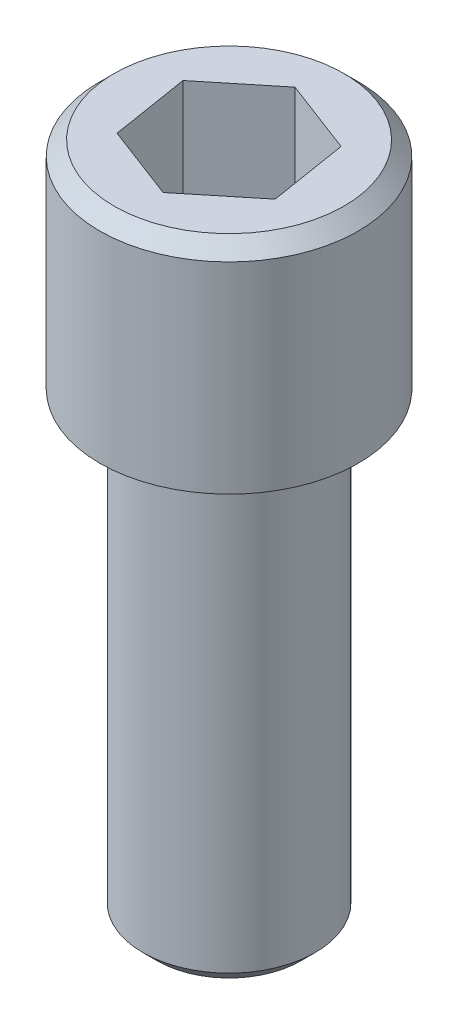
ISO-10303-21;
HEADER;
FILE_DESCRIPTION(('STEP AP214'),'2;1');
FILE_NAME('part.step','',(''),(''),'','','');
FILE_SCHEMA(('AUTOMOTIVE_DESIGN { 1 0 10303 214 1 1 1 1 }'));
ENDSEC;
DATA;
#1=APPLICATION_CONTEXT('core data for automotive mechanical design processes');
#2=APPLICATION_PROTOCOL_DEFINITION('international standard','automotive_design',2000,#1);
#3=PRODUCT_CONTEXT('',#1,'mechanical');
#4=PRODUCT('Part','Part','',(#3));
#5=PRODUCT_RELATED_PRODUCT_CATEGORY('part','',(#4));
#6=PRODUCT_DEFINITION_FORMATION('','',#4);
#7=PRODUCT_DEFINITION_CONTEXT('part definition',#1,'design');
#8=PRODUCT_DEFINITION('design','',#6,#7);
#9=PRODUCT_DEFINITION_SHAPE('','',#8);
#10=(LENGTH_UNIT() NAMED_UNIT(*) SI_UNIT(.MILLI.,.METRE.));
#11=(NAMED_UNIT(*) PLANE_ANGLE_UNIT() SI_UNIT($,.RADIAN.));
#12=(NAMED_UNIT(*) SI_UNIT($,.STERADIAN.) SOLID_ANGLE_UNIT());
#13=UNCERTAINTY_MEASURE_WITH_UNIT(LENGTH_MEASURE(1.E-05),#10,'distance_accuracy_value','');
#14=(GEOMETRIC_REPRESENTATION_CONTEXT(3) GLOBAL_UNCERTAINTY_ASSIGNED_CONTEXT((#13)) GLOBAL_UNIT_ASSIGNED_CONTEXT((#10,
#11,#12)) REPRESENTATION_CONTEXT('',''));
#15=CARTESIAN_POINT('',(0.,0.,0.));
#16=DIRECTION('',(0.,0.,1.));
#17=DIRECTION('',(1.,0.,0.));
#18=AXIS2_PLACEMENT_3D('',#15,#16,#17);
#19=CARTESIAN_POINT('',(0.,8.,0.));
#20=DIRECTION('',(0.,-1.,0.));
#21=DIRECTION('',(0.,0.,-1.));
#22=AXIS2_PLACEMENT_3D('',#19,#20,#21);
#23=CYLINDRICAL_SURFACE('',#22,1.5);
#24=CARTESIAN_POINT('',(0.,0.25,0.));
#25=DIRECTION('',(0.,1.,0.));
#26=DIRECTION('',(0.,0.,1.));
#27=AXIS2_PLACEMENT_3D('',#24,#25,#26);
#28=CIRCLE('',#27,1.5);
#29=CARTESIAN_POINT('',(0.,0.25,1.5));
#30=VERTEX_POINT('',#29);
#31=EDGE_CURVE('E41',#30,#30,#28,.T.);
#32=ORIENTED_EDGE('',*,*,#31,.T.);
#33=EDGE_LOOP('',(#32));
#34=FACE_BOUND('',#33,.T.);
#35=CARTESIAN_POINT('',(0.,8.,0.));
#36=DIRECTION('',(0.,1.,0.));
#37=DIRECTION('',(0.,0.,1.));
#38=AXIS2_PLACEMENT_3D('',#35,#36,#37);
#39=CIRCLE('',#38,1.5);
#40=CARTESIAN_POINT('',(0.,8.,1.5));
#41=VERTEX_POINT('',#40);
#42=EDGE_CURVE('E143',#41,#41,#39,.T.);
#43=ORIENTED_EDGE('',*,*,#42,.F.);
#44=EDGE_LOOP('',(#43));
#45=FACE_BOUND('',#44,.T.);
#46=ADVANCED_FACE('F33',(#34,#45),#23,.T.);
#47=CARTESIAN_POINT('',(0.,0.,0.));
#48=DIRECTION('',(0.,1.,0.));
#49=DIRECTION('',(0.,0.,1.));
#50=AXIS2_PLACEMENT_3D('',#47,#48,#49);
#51=PLANE('',#50);
#52=CARTESIAN_POINT('',(0.,0.,0.));
#53=DIRECTION('',(0.,1.,0.));
#54=DIRECTION('',(0.,0.,1.));
#55=AXIS2_PLACEMENT_3D('',#52,#53,#54);
#56=CIRCLE('',#55,1.25);
#57=CARTESIAN_POINT('',(0.,0.,1.25));
#58=VERTEX_POINT('',#57);
#59=EDGE_CURVE('E11',#58,#58,#56,.F.);
#60=ORIENTED_EDGE('',*,*,#59,.T.);
#61=EDGE_LOOP('',(#60));
#62=FACE_BOUND('',#61,.T.);
#63=ADVANCED_FACE('F165',(#62),#51,.F.);
#64=CARTESIAN_POINT('',(0.,11.75,0.));
#65=DIRECTION('',(0.,-1.,0.));
#66=DIRECTION('',(0.,0.,-1.));
#67=AXIS2_PLACEMENT_3D('',#64,#65,#66);
#68=CYLINDRICAL_SURFACE('',#67,2.25);
#69=CARTESIAN_POINT('',(0.,11.5,0.));
#70=DIRECTION('',(0.,1.,0.));
#71=DIRECTION('',(0.,0.,1.));
#72=AXIS2_PLACEMENT_3D('',#69,#70,#71);
#73=CIRCLE('',#72,2.25);
#74=CARTESIAN_POINT('',(0.,11.5,2.25));
#75=VERTEX_POINT('',#74);
#76=EDGE_CURVE('E149',#75,#75,#73,.F.);
#77=ORIENTED_EDGE('',*,*,#76,.T.);
#78=EDGE_LOOP('',(#77));
#79=FACE_BOUND('',#78,.T.);
#80=CARTESIAN_POINT('',(0.,8.,0.));
#81=DIRECTION('',(0.,1.,0.));
#82=DIRECTION('',(0.,0.,1.));
#83=AXIS2_PLACEMENT_3D('',#80,#81,#82);
#84=CIRCLE('',#83,2.25);
#85=CARTESIAN_POINT('',(0.,8.,2.25));
#86=VERTEX_POINT('',#85);
#87=EDGE_CURVE('E135',#86,#86,#84,.T.);
#88=ORIENTED_EDGE('',*,*,#87,.T.);
#89=EDGE_LOOP('',(#88));
#90=FACE_BOUND('',#89,.T.);
#91=ADVANCED_FACE('F170',(#79,#90),#68,.T.);
#92=CARTESIAN_POINT('',(0.,11.75,0.));
#93=DIRECTION('',(0.,1.,0.));
#94=DIRECTION('',(0.,0.,1.));
#95=AXIS2_PLACEMENT_3D('',#92,#93,#94);
#96=PLANE('',#95);
#97=CARTESIAN_POINT('',(0.,11.75,0.));
#98=DIRECTION('',(0.,1.,0.));
#99=DIRECTION('',(0.,0.,1.));
#100=AXIS2_PLACEMENT_3D('',#97,#98,#99);
#101=CIRCLE('',#100,1.99999999999999);
#102=CARTESIAN_POINT('',(0.,11.75,1.99999999999999));
#103=VERTEX_POINT('',#102);
#104=EDGE_CURVE('E146',#103,#103,#101,.T.);
#105=ORIENTED_EDGE('',*,*,#104,.T.);
#106=EDGE_LOOP('',(#105));
#107=FACE_BOUND('',#106,.T.);
#108=DIRECTION('',(0.159195520088402,0.,0.987247074639263));
#109=VECTOR('',#108,1.);
#110=CARTESIAN_POINT('',(-1.2949903812193,11.75,-0.492950213053497));
#111=LINE('',#110,#109);
#112=CARTESIAN_POINT('',(-1.2949903812193,11.75,-0.492950213053497));
#113=VERTEX_POINT('',#112);
#114=CARTESIAN_POINT('',(-1.07440259791493,11.75,0.875019461265662));
#115=VERTEX_POINT('',#114);
#116=EDGE_CURVE('E48',#113,#115,#111,.T.);
#117=ORIENTED_EDGE('',*,*,#116,.F.);
#118=DIRECTION('',(-0.775383286405273,0.,0.631490901884864));
#119=VECTOR('',#118,1.);
#120=CARTESIAN_POINT('',(-0.220587783304371,11.75,-1.36796967431916));
#121=LINE('',#120,#119);
#122=CARTESIAN_POINT('',(-0.220587783304371,11.75,-1.36796967431916));
#123=VERTEX_POINT('',#122);
#124=EDGE_CURVE('E131',#123,#113,#121,.T.);
#125=ORIENTED_EDGE('',*,*,#124,.F.);
#126=DIRECTION('',(-0.934578806493675,0.,-0.3557561727544));
#127=VECTOR('',#126,1.);
#128=CARTESIAN_POINT('',(1.07440259791493,11.75,-0.875019461265662));
#129=LINE('',#128,#127);
#130=CARTESIAN_POINT('',(1.07440259791493,11.75,-0.875019461265662));
#131=VERTEX_POINT('',#130);
#132=EDGE_CURVE('E129',#131,#123,#129,.T.);
#133=ORIENTED_EDGE('',*,*,#132,.F.);
#134=DIRECTION('',(-0.159195520088402,0.,-0.987247074639263));
#135=VECTOR('',#134,1.);
#136=CARTESIAN_POINT('',(1.2949903812193,11.75,0.492950213053496));
#137=LINE('',#136,#135);
#138=CARTESIAN_POINT('',(1.2949903812193,11.75,0.492950213053496));
#139=VERTEX_POINT('',#138);
#140=EDGE_CURVE('E96',#139,#131,#137,.T.);
#141=ORIENTED_EDGE('',*,*,#140,.F.);
#142=DIRECTION('',(0.775383286405273,0.,-0.631490901884864));
#143=VECTOR('',#142,1.);
#144=CARTESIAN_POINT('',(0.220587783304371,11.75,1.36796967431916));
#145=LINE('',#144,#143);
#146=CARTESIAN_POINT('',(0.220587783304371,11.75,1.36796967431916));
#147=VERTEX_POINT('',#146);
#148=EDGE_CURVE('E125',#147,#139,#145,.T.);
#149=ORIENTED_EDGE('',*,*,#148,.F.);
#150=DIRECTION('',(0.934578806493675,0.,0.3557561727544));
#151=VECTOR('',#150,1.);
#152=CARTESIAN_POINT('',(-1.07440259791493,11.75,0.875019461265662));
#153=LINE('',#152,#151);
#154=EDGE_CURVE('E122',#115,#147,#153,.T.);
#155=ORIENTED_EDGE('',*,*,#154,.F.);
#156=EDGE_LOOP('',(#117,#125,#133,#141,#149,#155));
#157=FACE_BOUND('',#156,.T.);
#158=ADVANCED_FACE('F176',(#107,#157),#96,.T.);
#159=CARTESIAN_POINT('',(0.,8.,0.));
#160=DIRECTION('',(0.,1.,0.));
#161=DIRECTION('',(0.,0.,1.));
#162=AXIS2_PLACEMENT_3D('',#159,#160,#161);
#163=PLANE('',#162);
#164=ORIENTED_EDGE('',*,*,#42,.T.);
#165=EDGE_LOOP('',(#164));
#166=FACE_BOUND('',#165,.T.);
#167=ORIENTED_EDGE('',*,*,#87,.F.);
#168=EDGE_LOOP('',(#167));
#169=FACE_BOUND('',#168,.T.);
#170=ADVANCED_FACE('F178',(#166,#169),#163,.F.);
#171=CARTESIAN_POINT('',(-1.2949903812193,9.5,-0.492950213053497));
#172=DIRECTION('',(-0.987247074639263,0.,0.159195520088402));
#173=DIRECTION('',(0.159195520088402,0.,0.987247074639263));
#174=AXIS2_PLACEMENT_3D('',#171,#172,#173);
#175=PLANE('',#174);
#176=ORIENTED_EDGE('',*,*,#116,.T.);
#177=DIRECTION('',(0.,1.,0.));
#178=VECTOR('',#177,1.);
#179=CARTESIAN_POINT('',(-1.07440259791493,9.5,0.875019461265662));
#180=LINE('',#179,#178);
#181=CARTESIAN_POINT('',(-1.07440259791493,9.5,0.875019461265662));
#182=VERTEX_POINT('',#181);
#183=EDGE_CURVE('E78',#182,#115,#180,.T.);
#184=ORIENTED_EDGE('',*,*,#183,.F.);
#185=DIRECTION('',(0.159195520088402,0.,0.987247074639263));
#186=VECTOR('',#185,1.);
#187=CARTESIAN_POINT('',(-1.2949903812193,9.5,-0.492950213053497));
#188=LINE('',#187,#186);
#189=CARTESIAN_POINT('',(-1.2949903812193,9.5,-0.492950213053497));
#190=VERTEX_POINT('',#189);
#191=EDGE_CURVE('E133',#190,#182,#188,.T.);
#192=ORIENTED_EDGE('',*,*,#191,.F.);
#193=DIRECTION('',(0.,1.,0.));
#194=VECTOR('',#193,1.);
#195=CARTESIAN_POINT('',(-1.2949903812193,9.5,-0.492950213053497));
#196=LINE('',#195,#194);
#197=EDGE_CURVE('E56',#190,#113,#196,.T.);
#198=ORIENTED_EDGE('',*,*,#197,.T.);
#199=EDGE_LOOP('',(#176,#184,#192,#198));
#200=FACE_BOUND('',#199,.T.);
#201=ADVANCED_FACE('F181',(#200),#175,.F.);
#202=CARTESIAN_POINT('',(-0.220587783304371,9.5,-1.36796967431916));
#203=DIRECTION('',(-0.631490901884864,0.,-0.775383286405273));
#204=DIRECTION('',(-0.775383286405273,0.,0.631490901884864));
#205=AXIS2_PLACEMENT_3D('',#202,#203,#204);
#206=PLANE('',#205);
#207=ORIENTED_EDGE('',*,*,#124,.T.);
#208=ORIENTED_EDGE('',*,*,#197,.F.);
#209=DIRECTION('',(-0.775383286405273,0.,0.631490901884864));
#210=VECTOR('',#209,1.);
#211=CARTESIAN_POINT('',(-0.220587783304371,9.5,-1.36796967431916));
#212=LINE('',#211,#210);
#213=CARTESIAN_POINT('',(-0.220587783304371,9.5,-1.36796967431916));
#214=VERTEX_POINT('',#213);
#215=EDGE_CURVE('E108',#214,#190,#212,.T.);
#216=ORIENTED_EDGE('',*,*,#215,.F.);
#217=DIRECTION('',(0.,1.,0.));
#218=VECTOR('',#217,1.);
#219=CARTESIAN_POINT('',(-0.220587783304371,9.5,-1.36796967431916));
#220=LINE('',#219,#218);
#221=EDGE_CURVE('E100',#214,#123,#220,.T.);
#222=ORIENTED_EDGE('',*,*,#221,.T.);
#223=EDGE_LOOP('',(#207,#208,#216,#222));
#224=FACE_BOUND('',#223,.T.);
#225=ADVANCED_FACE('F188',(#224),#206,.F.);
#226=CARTESIAN_POINT('',(1.07440259791493,9.5,-0.875019461265662));
#227=DIRECTION('',(0.3557561727544,0.,-0.934578806493675));
#228=DIRECTION('',(-0.934578806493675,0.,-0.3557561727544));
#229=AXIS2_PLACEMENT_3D('',#226,#227,#228);
#230=PLANE('',#229);
#231=ORIENTED_EDGE('',*,*,#132,.T.);
#232=ORIENTED_EDGE('',*,*,#221,.F.);
#233=DIRECTION('',(-0.934578806493675,0.,-0.3557561727544));
#234=VECTOR('',#233,1.);
#235=CARTESIAN_POINT('',(1.07440259791493,9.5,-0.875019461265662));
#236=LINE('',#235,#234);
#237=CARTESIAN_POINT('',(1.07440259791493,9.5,-0.875019461265662));
#238=VERTEX_POINT('',#237);
#239=EDGE_CURVE('E104',#238,#214,#236,.T.);
#240=ORIENTED_EDGE('',*,*,#239,.F.);
#241=DIRECTION('',(0.,1.,0.));
#242=VECTOR('',#241,1.);
#243=CARTESIAN_POINT('',(1.07440259791493,9.5,-0.875019461265662));
#244=LINE('',#243,#242);
#245=EDGE_CURVE('E89',#238,#131,#244,.T.);
#246=ORIENTED_EDGE('',*,*,#245,.T.);
#247=EDGE_LOOP('',(#231,#232,#240,#246));
#248=FACE_BOUND('',#247,.T.);
#249=ADVANCED_FACE('F105',(#248),#230,.F.);
#250=CARTESIAN_POINT('',(1.2949903812193,9.5,0.492950213053496));
#251=DIRECTION('',(0.987247074639263,0.,-0.159195520088402));
#252=DIRECTION('',(-0.159195520088403,0.,-0.987247074639263));
#253=AXIS2_PLACEMENT_3D('',#250,#251,#252);
#254=PLANE('',#253);
#255=ORIENTED_EDGE('',*,*,#140,.T.);
#256=ORIENTED_EDGE('',*,*,#245,.F.);
#257=DIRECTION('',(-0.159195520088402,0.,-0.987247074639263));
#258=VECTOR('',#257,1.);
#259=CARTESIAN_POINT('',(1.2949903812193,9.5,0.492950213053496));
#260=LINE('',#259,#258);
#261=CARTESIAN_POINT('',(1.2949903812193,9.5,0.492950213053496));
#262=VERTEX_POINT('',#261);
#263=EDGE_CURVE('E93',#262,#238,#260,.T.);
#264=ORIENTED_EDGE('',*,*,#263,.F.);
#265=DIRECTION('',(0.,1.,0.));
#266=VECTOR('',#265,1.);
#267=CARTESIAN_POINT('',(1.2949903812193,9.5,0.492950213053496));
#268=LINE('',#267,#266);
#269=EDGE_CURVE('E101',#262,#139,#268,.T.);
#270=ORIENTED_EDGE('',*,*,#269,.T.);
#271=EDGE_LOOP('',(#255,#256,#264,#270));
#272=FACE_BOUND('',#271,.T.);
#273=ADVANCED_FACE('F91',(#272),#254,.F.);
#274=CARTESIAN_POINT('',(0.220587783304371,9.5,1.36796967431916));
#275=DIRECTION('',(0.631490901884864,0.,0.775383286405273));
#276=DIRECTION('',(0.775383286405273,0.,-0.631490901884864));
#277=AXIS2_PLACEMENT_3D('',#274,#275,#276);
#278=PLANE('',#277);
#279=ORIENTED_EDGE('',*,*,#148,.T.);
#280=ORIENTED_EDGE('',*,*,#269,.F.);
#281=DIRECTION('',(0.775383286405273,0.,-0.631490901884864));
#282=VECTOR('',#281,1.);
#283=CARTESIAN_POINT('',(0.220587783304371,9.5,1.36796967431916));
#284=LINE('',#283,#282);
#285=CARTESIAN_POINT('',(0.220587783304371,9.5,1.36796967431916));
#286=VERTEX_POINT('',#285);
#287=EDGE_CURVE('E114',#286,#262,#284,.T.);
#288=ORIENTED_EDGE('',*,*,#287,.F.);
#289=DIRECTION('',(0.,1.,0.));
#290=VECTOR('',#289,1.);
#291=CARTESIAN_POINT('',(0.220587783304371,9.5,1.36796967431916));
#292=LINE('',#291,#290);
#293=EDGE_CURVE('E138',#286,#147,#292,.T.);
#294=ORIENTED_EDGE('',*,*,#293,.T.);
#295=EDGE_LOOP('',(#279,#280,#288,#294));
#296=FACE_BOUND('',#295,.T.);
#297=ADVANCED_FACE('F192',(#296),#278,.F.);
#298=CARTESIAN_POINT('',(-1.07440259791493,9.5,0.875019461265662));
#299=DIRECTION('',(-0.3557561727544,0.,0.934578806493675));
#300=DIRECTION('',(0.934578806493675,0.,0.3557561727544));
#301=AXIS2_PLACEMENT_3D('',#298,#299,#300);
#302=PLANE('',#301);
#303=ORIENTED_EDGE('',*,*,#154,.T.);
#304=ORIENTED_EDGE('',*,*,#293,.F.);
#305=DIRECTION('',(0.934578806493675,0.,0.3557561727544));
#306=VECTOR('',#305,1.);
#307=CARTESIAN_POINT('',(-1.07440259791493,9.5,0.875019461265662));
#308=LINE('',#307,#306);
#309=EDGE_CURVE('E116',#182,#286,#308,.T.);
#310=ORIENTED_EDGE('',*,*,#309,.F.);
#311=ORIENTED_EDGE('',*,*,#183,.T.);
#312=EDGE_LOOP('',(#303,#304,#310,#311));
#313=FACE_BOUND('',#312,.T.);
#314=ADVANCED_FACE('F189',(#313),#302,.F.);
#315=CARTESIAN_POINT('',(0.,9.5,0.));
#316=DIRECTION('',(0.,1.,0.));
#317=DIRECTION('',(0.,0.,1.));
#318=AXIS2_PLACEMENT_3D('',#315,#316,#317);
#319=PLANE('',#318);
#320=ORIENTED_EDGE('',*,*,#191,.T.);
#321=ORIENTED_EDGE('',*,*,#309,.T.);
#322=ORIENTED_EDGE('',*,*,#287,.T.);
#323=ORIENTED_EDGE('',*,*,#263,.T.);
#324=ORIENTED_EDGE('',*,*,#239,.T.);
#325=ORIENTED_EDGE('',*,*,#215,.T.);
#326=EDGE_LOOP('',(#320,#321,#322,#323,#324,#325));
#327=FACE_BOUND('',#326,.T.);
#328=ADVANCED_FACE('F111',(#327),#319,.T.);
#329=CARTESIAN_POINT('',(0.,11.75,0.));
#330=DIRECTION('',(0.,-1.,0.));
#331=DIRECTION('',(0.,0.,-1.));
#332=AXIS2_PLACEMENT_3D('',#329,#330,#331);
#333=CONICAL_SURFACE('',#332,1.99999999999999,0.785398163397451);
#334=ORIENTED_EDGE('',*,*,#76,.F.);
#335=EDGE_LOOP('',(#334));
#336=FACE_BOUND('',#335,.T.);
#337=ORIENTED_EDGE('',*,*,#104,.F.);
#338=EDGE_LOOP('',(#337));
#339=FACE_BOUND('',#338,.T.);
#340=ADVANCED_FACE('F157',(#336,#339),#333,.T.);
#341=CARTESIAN_POINT('',(0.,0.25,0.));
#342=DIRECTION('',(0.,1.,0.));
#343=DIRECTION('',(0.,0.,1.));
#344=AXIS2_PLACEMENT_3D('',#341,#342,#343);
#345=CONICAL_SURFACE('',#344,1.5,0.785398163397452);
#346=ORIENTED_EDGE('',*,*,#59,.F.);
#347=EDGE_LOOP('',(#346));
#348=FACE_BOUND('',#347,.T.);
#349=ORIENTED_EDGE('',*,*,#31,.F.);
#350=EDGE_LOOP('',(#349));
#351=FACE_BOUND('',#350,.T.);
#352=ADVANCED_FACE('F35',(#348,#351),#345,.T.);
#353=CLOSED_SHELL('',(#46,#63,#91,#158,#170,#201,#225,#249,#273,#297,#314,#328,#340,#352));
#354=MANIFOLD_SOLID_BREP('B2',#353);
#355=ADVANCED_BREP_SHAPE_REPRESENTATION('',(#18,#354),#14);
#356=SHAPE_DEFINITION_REPRESENTATION(#9,#355);
ENDSEC;
END-ISO-10303-21;
